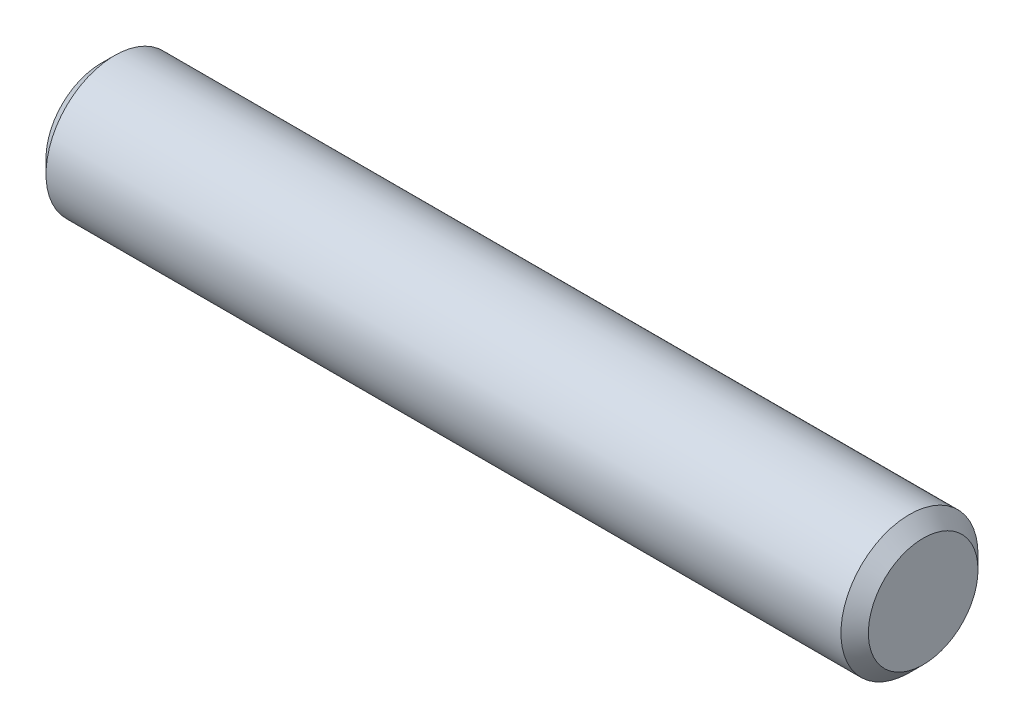
ISO-10303-21;
HEADER;
FILE_DESCRIPTION(('STEP AP214'),'2;1');
FILE_NAME('part.step','',(''),(''),'','','');
FILE_SCHEMA(('AUTOMOTIVE_DESIGN { 1 0 10303 214 1 1 1 1 }'));
ENDSEC;
DATA;
#1=APPLICATION_CONTEXT('core data for automotive mechanical design processes');
#2=APPLICATION_PROTOCOL_DEFINITION('international standard','automotive_design',2000,#1);
#3=PRODUCT_CONTEXT('',#1,'mechanical');
#4=PRODUCT('Part','Part','',(#3));
#5=PRODUCT_RELATED_PRODUCT_CATEGORY('part','',(#4));
#6=PRODUCT_DEFINITION_FORMATION('','',#4);
#7=PRODUCT_DEFINITION_CONTEXT('part definition',#1,'design');
#8=PRODUCT_DEFINITION('design','',#6,#7);
#9=PRODUCT_DEFINITION_SHAPE('','',#8);
#10=(LENGTH_UNIT() NAMED_UNIT(*) SI_UNIT(.MILLI.,.METRE.));
#11=(NAMED_UNIT(*) PLANE_ANGLE_UNIT() SI_UNIT($,.RADIAN.));
#12=(NAMED_UNIT(*) SI_UNIT($,.STERADIAN.) SOLID_ANGLE_UNIT());
#13=UNCERTAINTY_MEASURE_WITH_UNIT(LENGTH_MEASURE(1.E-05),#10,'distance_accuracy_value','');
#14=(GEOMETRIC_REPRESENTATION_CONTEXT(3) GLOBAL_UNCERTAINTY_ASSIGNED_CONTEXT((#13)) GLOBAL_UNIT_ASSIGNED_CONTEXT((#10,
#11,#12)) REPRESENTATION_CONTEXT('',''));
#15=CARTESIAN_POINT('',(0.,0.,0.));
#16=DIRECTION('',(0.,0.,1.));
#17=DIRECTION('',(1.,0.,0.));
#18=AXIS2_PLACEMENT_3D('',#15,#16,#17);
#19=CARTESIAN_POINT('',(-19.05,0.,0.));
#20=DIRECTION('',(1.,0.,0.));
#21=DIRECTION('',(0.,0.,-1.));
#22=AXIS2_PLACEMENT_3D('',#19,#20,#21);
#23=CYLINDRICAL_SURFACE('',#22,3.175);
#24=CARTESIAN_POINT('',(18.415,0.,0.));
#25=DIRECTION('',(1.,0.,0.));
#26=DIRECTION('',(0.,0.,-1.));
#27=AXIS2_PLACEMENT_3D('',#24,#25,#26);
#28=CIRCLE('',#27,3.175);
#29=CARTESIAN_POINT('',(18.415,0.,-3.175));
#30=VERTEX_POINT('',#29);
#31=EDGE_CURVE('E36',#30,#30,#28,.F.);
#32=ORIENTED_EDGE('',*,*,#31,.T.);
#33=EDGE_LOOP('',(#32));
#34=FACE_BOUND('',#33,.T.);
#35=CARTESIAN_POINT('',(-18.415,0.,0.));
#36=DIRECTION('',(1.,0.,0.));
#37=DIRECTION('',(0.,0.,-1.));
#38=AXIS2_PLACEMENT_3D('',#35,#36,#37);
#39=CIRCLE('',#38,3.175);
#40=CARTESIAN_POINT('',(-18.415,0.,-3.175));
#41=VERTEX_POINT('',#40);
#42=EDGE_CURVE('E40',#41,#41,#39,.T.);
#43=ORIENTED_EDGE('',*,*,#42,.T.);
#44=EDGE_LOOP('',(#43));
#45=FACE_BOUND('',#44,.T.);
#46=ADVANCED_FACE('F29',(#34,#45),#23,.T.);
#47=CARTESIAN_POINT('',(-19.05,0.,0.));
#48=DIRECTION('',(1.,0.,0.));
#49=DIRECTION('',(0.,0.,-1.));
#50=AXIS2_PLACEMENT_3D('',#47,#48,#49);
#51=PLANE('',#50);
#52=CARTESIAN_POINT('',(-19.05,0.,0.));
#53=DIRECTION('',(1.,0.,0.));
#54=DIRECTION('',(0.,0.,-1.));
#55=AXIS2_PLACEMENT_3D('',#52,#53,#54);
#56=CIRCLE('',#55,2.54);
#57=CARTESIAN_POINT('',(-19.05,0.,-2.54));
#58=VERTEX_POINT('',#57);
#59=EDGE_CURVE('E10',#58,#58,#56,.F.);
#60=ORIENTED_EDGE('',*,*,#59,.T.);
#61=EDGE_LOOP('',(#60));
#62=FACE_BOUND('',#61,.T.);
#63=ADVANCED_FACE('F60',(#62),#51,.F.);
#64=CARTESIAN_POINT('',(19.05,0.,0.));
#65=DIRECTION('',(1.,0.,0.));
#66=DIRECTION('',(0.,0.,-1.));
#67=AXIS2_PLACEMENT_3D('',#64,#65,#66);
#68=PLANE('',#67);
#69=CARTESIAN_POINT('',(19.05,0.,0.));
#70=DIRECTION('',(1.,0.,0.));
#71=DIRECTION('',(0.,0.,-1.));
#72=AXIS2_PLACEMENT_3D('',#69,#70,#71);
#73=CIRCLE('',#72,2.54);
#74=CARTESIAN_POINT('',(19.05,0.,-2.54));
#75=VERTEX_POINT('',#74);
#76=EDGE_CURVE('E44',#75,#75,#73,.T.);
#77=ORIENTED_EDGE('',*,*,#76,.T.);
#78=EDGE_LOOP('',(#77));
#79=FACE_BOUND('',#78,.T.);
#80=ADVANCED_FACE('F50',(#79),#68,.T.);
#81=CARTESIAN_POINT('',(19.05,0.,0.));
#82=DIRECTION('',(-1.,0.,0.));
#83=DIRECTION('',(0.,0.,1.));
#84=AXIS2_PLACEMENT_3D('',#81,#82,#83);
#85=CONICAL_SURFACE('',#84,2.54,0.78539816339745);
#86=ORIENTED_EDGE('',*,*,#31,.F.);
#87=EDGE_LOOP('',(#86));
#88=FACE_BOUND('',#87,.T.);
#89=ORIENTED_EDGE('',*,*,#76,.F.);
#90=EDGE_LOOP('',(#89));
#91=FACE_BOUND('',#90,.T.);
#92=ADVANCED_FACE('F52',(#88,#91),#85,.T.);
#93=CARTESIAN_POINT('',(-18.415,0.,0.));
#94=DIRECTION('',(1.,0.,0.));
#95=DIRECTION('',(0.,0.,-1.));
#96=AXIS2_PLACEMENT_3D('',#93,#94,#95);
#97=CONICAL_SURFACE('',#96,3.175,0.785398163397453);
#98=ORIENTED_EDGE('',*,*,#59,.F.);
#99=EDGE_LOOP('',(#98));
#100=FACE_BOUND('',#99,.T.);
#101=ORIENTED_EDGE('',*,*,#42,.F.);
#102=EDGE_LOOP('',(#101));
#103=FACE_BOUND('',#102,.T.);
#104=ADVANCED_FACE('F31',(#100,#103),#97,.T.);
#105=CLOSED_SHELL('',(#46,#63,#80,#92,#104));
#106=MANIFOLD_SOLID_BREP('B2',#105);
#107=ADVANCED_BREP_SHAPE_REPRESENTATION('',(#18,#106),#14);
#108=SHAPE_DEFINITION_REPRESENTATION(#9,#107);
ENDSEC;
END-ISO-10303-21;
